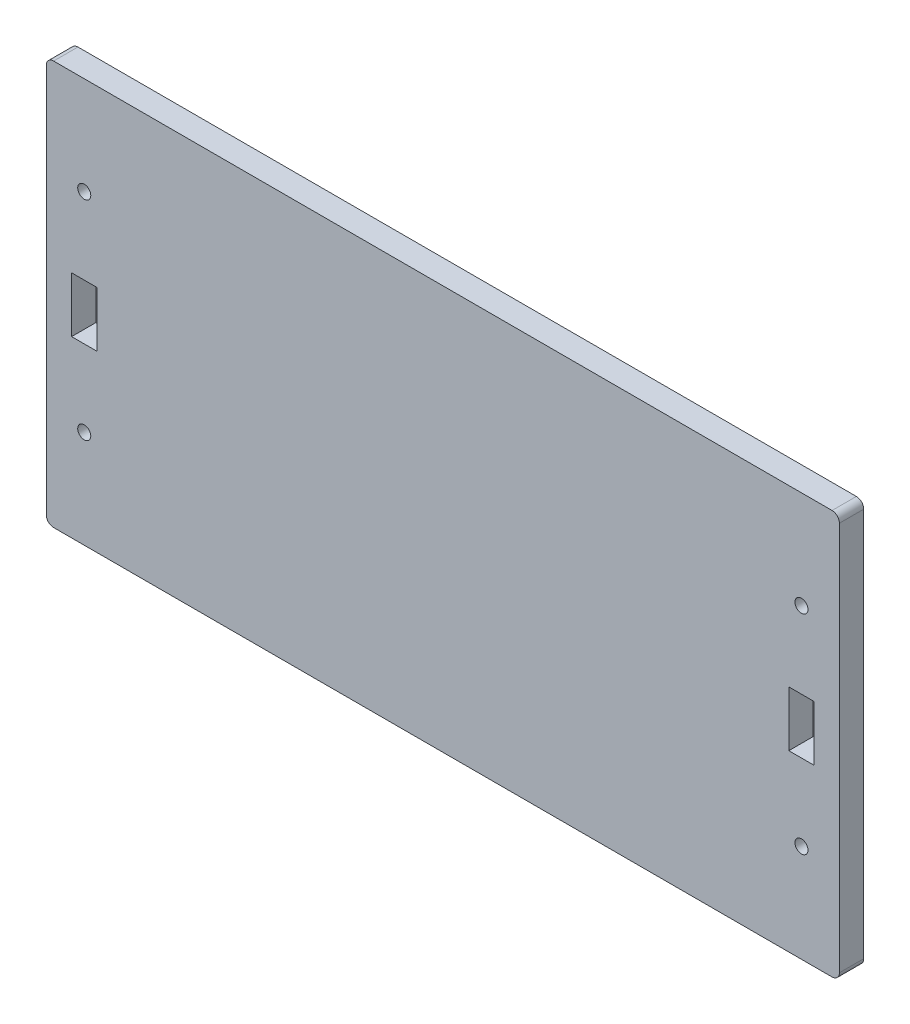
ISO-10303-21;
HEADER;
FILE_DESCRIPTION(('STEP AP214'),'2;1');
FILE_NAME('part.step','',(''),(''),'','','');
FILE_SCHEMA(('AUTOMOTIVE_DESIGN { 1 0 10303 214 1 1 1 1 }'));
ENDSEC;
DATA;
#1=APPLICATION_CONTEXT('core data for automotive mechanical design processes');
#2=APPLICATION_PROTOCOL_DEFINITION('international standard','automotive_design',2000,#1);
#3=PRODUCT_CONTEXT('',#1,'mechanical');
#4=PRODUCT('Part','Part','',(#3));
#5=PRODUCT_RELATED_PRODUCT_CATEGORY('part','',(#4));
#6=PRODUCT_DEFINITION_FORMATION('','',#4);
#7=PRODUCT_DEFINITION_CONTEXT('part definition',#1,'design');
#8=PRODUCT_DEFINITION('design','',#6,#7);
#9=PRODUCT_DEFINITION_SHAPE('','',#8);
#10=(LENGTH_UNIT() NAMED_UNIT(*) SI_UNIT(.MILLI.,.METRE.));
#11=(NAMED_UNIT(*) PLANE_ANGLE_UNIT() SI_UNIT($,.RADIAN.));
#12=(NAMED_UNIT(*) SI_UNIT($,.STERADIAN.) SOLID_ANGLE_UNIT());
#13=UNCERTAINTY_MEASURE_WITH_UNIT(LENGTH_MEASURE(1.E-05),#10,'distance_accuracy_value','');
#14=(GEOMETRIC_REPRESENTATION_CONTEXT(3) GLOBAL_UNCERTAINTY_ASSIGNED_CONTEXT((#13)) GLOBAL_UNIT_ASSIGNED_CONTEXT((#10,
#11,#12)) REPRESENTATION_CONTEXT('',''));
#15=CARTESIAN_POINT('',(0.,0.,0.));
#16=DIRECTION('',(0.,0.,1.));
#17=DIRECTION('',(1.,0.,0.));
#18=AXIS2_PLACEMENT_3D('',#15,#16,#17);
#19=CARTESIAN_POINT('',(213.27999990396,2.00000000000004,6.6));
#20=DIRECTION('',(0.,0.,1.));
#21=DIRECTION('',(1.,0.,0.));
#22=AXIS2_PLACEMENT_3D('',#19,#20,#21);
#23=PLANE('',#22);
#24=DIRECTION('',(1.,0.,0.));
#25=VECTOR('',#24,1.);
#26=CARTESIAN_POINT('',(201.54000000022,47.32615549736,6.6));
#27=LINE('',#26,#25);
#28=CARTESIAN_POINT('',(201.54000000022,47.32615549736,6.6));
#29=VERTEX_POINT('',#28);
#30=CARTESIAN_POINT('',(208.39999999876,47.32615549736,6.6));
#31=VERTEX_POINT('',#30);
#32=EDGE_CURVE('E184',#29,#31,#27,.T.);
#33=ORIENTED_EDGE('',*,*,#32,.F.);
#34=DIRECTION('',(0.,-1.,0.));
#35=VECTOR('',#34,1.);
#36=CARTESIAN_POINT('',(201.54000000022,62.3261554973,6.6));
#37=LINE('',#36,#35);
#38=CARTESIAN_POINT('',(201.54000000022,62.3261554973,6.6));
#39=VERTEX_POINT('',#38);
#40=EDGE_CURVE('E182',#39,#29,#37,.T.);
#41=ORIENTED_EDGE('',*,*,#40,.F.);
#42=DIRECTION('',(-1.,0.,0.));
#43=VECTOR('',#42,1.);
#44=CARTESIAN_POINT('',(208.39999999876,62.3261554973,6.6));
#45=LINE('',#44,#43);
#46=CARTESIAN_POINT('',(208.39999999876,62.3261554973,6.6));
#47=VERTEX_POINT('',#46);
#48=EDGE_CURVE('E190',#47,#39,#45,.T.);
#49=ORIENTED_EDGE('',*,*,#48,.F.);
#50=DIRECTION('',(0.,1.,0.));
#51=VECTOR('',#50,1.);
#52=CARTESIAN_POINT('',(208.39999999876,47.32615549736,6.6));
#53=LINE('',#52,#51);
#54=EDGE_CURVE('E187',#31,#47,#53,.T.);
#55=ORIENTED_EDGE('',*,*,#54,.F.);
#56=EDGE_LOOP('',(#33,#41,#49,#55));
#57=FACE_BOUND('',#56,.T.);
#58=CARTESIAN_POINT('',(204.97000000076,26.55115549804,6.6));
#59=DIRECTION('',(0.,0.,1.));
#60=DIRECTION('',(1.,0.,0.));
#61=AXIS2_PLACEMENT_3D('',#58,#59,#60);
#62=CIRCLE('',#61,1.77500000000005);
#63=CARTESIAN_POINT('',(206.74500000076,26.55115549804,6.6));
#64=VERTEX_POINT('',#63);
#65=EDGE_CURVE('E219',#64,#64,#62,.T.);
#66=ORIENTED_EDGE('',*,*,#65,.F.);
#67=EDGE_LOOP('',(#66));
#68=FACE_BOUND('',#67,.T.);
#69=CARTESIAN_POINT('',(10.30999999972,83.10115549662,6.6));
#70=DIRECTION('',(0.,0.,1.));
#71=DIRECTION('',(1.,0.,0.));
#72=AXIS2_PLACEMENT_3D('',#69,#70,#71);
#73=CIRCLE('',#72,1.77500000000004);
#74=CARTESIAN_POINT('',(12.08499999972,83.10115549662,6.6));
#75=VERTEX_POINT('',#74);
#76=EDGE_CURVE('E231',#75,#75,#73,.T.);
#77=ORIENTED_EDGE('',*,*,#76,.F.);
#78=EDGE_LOOP('',(#77));
#79=FACE_BOUND('',#78,.T.);
#80=CARTESIAN_POINT('',(213.27999990396,2.00000000000004,6.6));
#81=DIRECTION('',(0.,0.,1.));
#82=DIRECTION('',(1.,0.,0.));
#83=AXIS2_PLACEMENT_3D('',#80,#81,#82);
#84=CIRCLE('',#83,2.00000000000005);
#85=CARTESIAN_POINT('',(213.27999990346,0.,6.6));
#86=VERTEX_POINT('',#85);
#87=CARTESIAN_POINT('',(215.27999990396,2.0000000005,6.6));
#88=VERTEX_POINT('',#87);
#89=EDGE_CURVE('E237',#86,#88,#84,.T.);
#90=ORIENTED_EDGE('',*,*,#89,.T.);
#91=DIRECTION('',(0.,1.,0.));
#92=VECTOR('',#91,1.);
#93=CARTESIAN_POINT('',(215.27999990396,2.0000000005,6.6));
#94=LINE('',#93,#92);
#95=CARTESIAN_POINT('',(215.27999990396,107.66000000088,6.6));
#96=VERTEX_POINT('',#95);
#97=EDGE_CURVE('E240',#88,#96,#94,.T.);
#98=ORIENTED_EDGE('',*,*,#97,.T.);
#99=CARTESIAN_POINT('',(213.27999990396,107.65999999884,6.6));
#100=DIRECTION('',(0.,0.,1.));
#101=DIRECTION('',(1.,0.,0.));
#102=AXIS2_PLACEMENT_3D('',#99,#100,#101);
#103=CIRCLE('',#102,1.99999999999997);
#104=CARTESIAN_POINT('',(213.27999990346,109.65999999884,6.6));
#105=VERTEX_POINT('',#104);
#106=EDGE_CURVE('E243',#96,#105,#103,.T.);
#107=ORIENTED_EDGE('',*,*,#106,.T.);
#108=DIRECTION('',(-1.,0.,0.));
#109=VECTOR('',#108,1.);
#110=CARTESIAN_POINT('',(213.27999990346,109.65999999884,6.6));
#111=LINE('',#110,#109);
#112=CARTESIAN_POINT('',(2.0000000005,109.65999999884,6.6));
#113=VERTEX_POINT('',#112);
#114=EDGE_CURVE('E245',#105,#113,#111,.T.);
#115=ORIENTED_EDGE('',*,*,#114,.T.);
#116=CARTESIAN_POINT('',(1.99999999999997,107.65999999884,6.6));
#117=DIRECTION('',(0.,0.,1.));
#118=DIRECTION('',(1.,0.,0.));
#119=AXIS2_PLACEMENT_3D('',#116,#117,#118);
#120=CIRCLE('',#119,1.99999999999997);
#121=CARTESIAN_POINT('',(0.,107.66000000088,6.6));
#122=VERTEX_POINT('',#121);
#123=EDGE_CURVE('E247',#113,#122,#120,.T.);
#124=ORIENTED_EDGE('',*,*,#123,.T.);
#125=DIRECTION('',(0.,-1.,0.));
#126=VECTOR('',#125,1.);
#127=CARTESIAN_POINT('',(0.,107.66000000088,6.6));
#128=LINE('',#127,#126);
#129=CARTESIAN_POINT('',(0.,2.0000000005,6.6));
#130=VERTEX_POINT('',#129);
#131=EDGE_CURVE('E249',#122,#130,#128,.T.);
#132=ORIENTED_EDGE('',*,*,#131,.T.);
#133=CARTESIAN_POINT('',(2.00000000000001,2.00000000000001,6.6));
#134=DIRECTION('',(0.,0.,1.));
#135=DIRECTION('',(1.,0.,0.));
#136=AXIS2_PLACEMENT_3D('',#133,#134,#135);
#137=CIRCLE('',#136,2.00000000000001);
#138=CARTESIAN_POINT('',(2.0000000005,0.,6.6));
#139=VERTEX_POINT('',#138);
#140=EDGE_CURVE('E251',#130,#139,#137,.T.);
#141=ORIENTED_EDGE('',*,*,#140,.T.);
#142=DIRECTION('',(1.,0.,0.));
#143=VECTOR('',#142,1.);
#144=CARTESIAN_POINT('',(2.0000000005,0.,6.6));
#145=LINE('',#144,#143);
#146=EDGE_CURVE('E253',#139,#86,#145,.T.);
#147=ORIENTED_EDGE('',*,*,#146,.T.);
#148=EDGE_LOOP('',(#90,#98,#107,#115,#124,#132,#141,#147));
#149=FACE_BOUND('',#148,.T.);
#150=CARTESIAN_POINT('',(10.30999999972,26.55115549804,6.6));
#151=DIRECTION('',(0.,0.,1.));
#152=DIRECTION('',(1.,0.,0.));
#153=AXIS2_PLACEMENT_3D('',#150,#151,#152);
#154=CIRCLE('',#153,1.77499999999998);
#155=CARTESIAN_POINT('',(12.08499999972,26.55115549804,6.6));
#156=VERTEX_POINT('',#155);
#157=EDGE_CURVE('E225',#156,#156,#154,.T.);
#158=ORIENTED_EDGE('',*,*,#157,.F.);
#159=EDGE_LOOP('',(#158));
#160=FACE_BOUND('',#159,.T.);
#161=CARTESIAN_POINT('',(204.97000000076,83.10115549662,6.6));
#162=DIRECTION('',(0.,0.,1.));
#163=DIRECTION('',(1.,0.,0.));
#164=AXIS2_PLACEMENT_3D('',#161,#162,#163);
#165=CIRCLE('',#164,1.775);
#166=CARTESIAN_POINT('',(206.74500000076,83.10115549662,6.6));
#167=VERTEX_POINT('',#166);
#168=EDGE_CURVE('E213',#167,#167,#165,.T.);
#169=ORIENTED_EDGE('',*,*,#168,.F.);
#170=EDGE_LOOP('',(#169));
#171=FACE_BOUND('',#170,.T.);
#172=DIRECTION('',(0.,1.,0.));
#173=VECTOR('',#172,1.);
#174=CARTESIAN_POINT('',(13.74000000026,47.32615549736,6.6));
#175=LINE('',#174,#173);
#176=CARTESIAN_POINT('',(13.74000000026,47.32615549736,6.6));
#177=VERTEX_POINT('',#176);
#178=CARTESIAN_POINT('',(13.74000000026,62.3261554973,6.6));
#179=VERTEX_POINT('',#178);
#180=EDGE_CURVE('E154',#177,#179,#175,.T.);
#181=ORIENTED_EDGE('',*,*,#180,.F.);
#182=DIRECTION('',(1.,0.,0.));
#183=VECTOR('',#182,1.);
#184=CARTESIAN_POINT('',(6.87999999918,47.32615549736,6.6));
#185=LINE('',#184,#183);
#186=CARTESIAN_POINT('',(6.87999999918,47.32615549736,6.6));
#187=VERTEX_POINT('',#186);
#188=EDGE_CURVE('E146',#187,#177,#185,.T.);
#189=ORIENTED_EDGE('',*,*,#188,.F.);
#190=DIRECTION('',(0.,-1.,0.));
#191=VECTOR('',#190,1.);
#192=CARTESIAN_POINT('',(6.87999999918,62.3261554973,6.6));
#193=LINE('',#192,#191);
#194=CARTESIAN_POINT('',(6.87999999917999,62.3261554973,6.6));
#195=VERTEX_POINT('',#194);
#196=EDGE_CURVE('E168',#195,#187,#193,.T.);
#197=ORIENTED_EDGE('',*,*,#196,.F.);
#198=DIRECTION('',(-1.,0.,0.));
#199=VECTOR('',#198,1.);
#200=CARTESIAN_POINT('',(13.74000000026,62.3261554973,6.6));
#201=LINE('',#200,#199);
#202=EDGE_CURVE('E166',#179,#195,#201,.T.);
#203=ORIENTED_EDGE('',*,*,#202,.F.);
#204=EDGE_LOOP('',(#181,#189,#197,#203));
#205=FACE_BOUND('',#204,.T.);
#206=ADVANCED_FACE('F33',(#57,#68,#79,#149,#160,#171,#205),#23,.T.);
#207=CARTESIAN_POINT('',(213.27999990396,2.00000000000004,0.));
#208=DIRECTION('',(0.,0.,1.));
#209=DIRECTION('',(1.,0.,0.));
#210=AXIS2_PLACEMENT_3D('',#207,#208,#209);
#211=PLANE('',#210);
#212=DIRECTION('',(0.,-1.,0.));
#213=VECTOR('',#212,1.);
#214=CARTESIAN_POINT('',(201.54000000022,62.3261554973,0.));
#215=LINE('',#214,#213);
#216=CARTESIAN_POINT('',(201.54000000022,62.3261554973,0.));
#217=VERTEX_POINT('',#216);
#218=CARTESIAN_POINT('',(201.54000000022,47.32615549736,0.));
#219=VERTEX_POINT('',#218);
#220=EDGE_CURVE('E162',#217,#219,#215,.T.);
#221=ORIENTED_EDGE('',*,*,#220,.T.);
#222=DIRECTION('',(1.,0.,0.));
#223=VECTOR('',#222,1.);
#224=CARTESIAN_POINT('',(201.54000000022,47.32615549736,0.));
#225=LINE('',#224,#223);
#226=CARTESIAN_POINT('',(208.39999999876,47.32615549736,0.));
#227=VERTEX_POINT('',#226);
#228=EDGE_CURVE('E195',#219,#227,#225,.T.);
#229=ORIENTED_EDGE('',*,*,#228,.T.);
#230=DIRECTION('',(0.,1.,0.));
#231=VECTOR('',#230,1.);
#232=CARTESIAN_POINT('',(208.39999999876,47.32615549736,0.));
#233=LINE('',#232,#231);
#234=CARTESIAN_POINT('',(208.39999999876,62.3261554973,0.));
#235=VERTEX_POINT('',#234);
#236=EDGE_CURVE('E198',#227,#235,#233,.T.);
#237=ORIENTED_EDGE('',*,*,#236,.T.);
#238=DIRECTION('',(-1.,0.,0.));
#239=VECTOR('',#238,1.);
#240=CARTESIAN_POINT('',(208.39999999876,62.3261554973,0.));
#241=LINE('',#240,#239);
#242=EDGE_CURVE('E185',#235,#217,#241,.T.);
#243=ORIENTED_EDGE('',*,*,#242,.T.);
#244=EDGE_LOOP('',(#221,#229,#237,#243));
#245=FACE_BOUND('',#244,.T.);
#246=CARTESIAN_POINT('',(204.97000000076,26.55115549804,0.));
#247=DIRECTION('',(0.,0.,1.));
#248=DIRECTION('',(1.,0.,0.));
#249=AXIS2_PLACEMENT_3D('',#246,#247,#248);
#250=CIRCLE('',#249,1.77500000000005);
#251=CARTESIAN_POINT('',(206.74500000076,26.55115549804,0.));
#252=VERTEX_POINT('',#251);
#253=EDGE_CURVE('E216',#252,#252,#250,.T.);
#254=ORIENTED_EDGE('',*,*,#253,.T.);
#255=EDGE_LOOP('',(#254));
#256=FACE_BOUND('',#255,.T.);
#257=CARTESIAN_POINT('',(10.30999999972,83.10115549662,0.));
#258=DIRECTION('',(0.,0.,1.));
#259=DIRECTION('',(1.,0.,0.));
#260=AXIS2_PLACEMENT_3D('',#257,#258,#259);
#261=CIRCLE('',#260,1.77500000000004);
#262=CARTESIAN_POINT('',(12.08499999972,83.10115549662,0.));
#263=VERTEX_POINT('',#262);
#264=EDGE_CURVE('E228',#263,#263,#261,.T.);
#265=ORIENTED_EDGE('',*,*,#264,.T.);
#266=EDGE_LOOP('',(#265));
#267=FACE_BOUND('',#266,.T.);
#268=CARTESIAN_POINT('',(213.27999990396,2.00000000000004,0.));
#269=DIRECTION('',(0.,0.,1.));
#270=DIRECTION('',(1.,0.,0.));
#271=AXIS2_PLACEMENT_3D('',#268,#269,#270);
#272=CIRCLE('',#271,2.00000000000005);
#273=CARTESIAN_POINT('',(213.27999990346,0.,0.));
#274=VERTEX_POINT('',#273);
#275=CARTESIAN_POINT('',(215.27999990396,2.0000000005,0.));
#276=VERTEX_POINT('',#275);
#277=EDGE_CURVE('E234',#274,#276,#272,.T.);
#278=ORIENTED_EDGE('',*,*,#277,.F.);
#279=DIRECTION('',(1.,0.,0.));
#280=VECTOR('',#279,1.);
#281=CARTESIAN_POINT('',(2.0000000005,0.,0.));
#282=LINE('',#281,#280);
#283=CARTESIAN_POINT('',(2.0000000005,0.,0.));
#284=VERTEX_POINT('',#283);
#285=EDGE_CURVE('E241',#284,#274,#282,.T.);
#286=ORIENTED_EDGE('',*,*,#285,.F.);
#287=CARTESIAN_POINT('',(2.00000000000001,2.00000000000001,0.));
#288=DIRECTION('',(0.,0.,1.));
#289=DIRECTION('',(1.,0.,0.));
#290=AXIS2_PLACEMENT_3D('',#287,#288,#289);
#291=CIRCLE('',#290,2.00000000000001);
#292=CARTESIAN_POINT('',(0.,2.0000000005,0.));
#293=VERTEX_POINT('',#292);
#294=EDGE_CURVE('E268',#293,#284,#291,.T.);
#295=ORIENTED_EDGE('',*,*,#294,.F.);
#296=DIRECTION('',(0.,-1.,0.));
#297=VECTOR('',#296,1.);
#298=CARTESIAN_POINT('',(0.,107.66000000088,0.));
#299=LINE('',#298,#297);
#300=CARTESIAN_POINT('',(0.,107.66000000088,0.));
#301=VERTEX_POINT('',#300);
#302=EDGE_CURVE('E266',#301,#293,#299,.T.);
#303=ORIENTED_EDGE('',*,*,#302,.F.);
#304=CARTESIAN_POINT('',(1.99999999999997,107.65999999884,0.));
#305=DIRECTION('',(0.,0.,1.));
#306=DIRECTION('',(1.,0.,0.));
#307=AXIS2_PLACEMENT_3D('',#304,#305,#306);
#308=CIRCLE('',#307,1.99999999999997);
#309=CARTESIAN_POINT('',(2.0000000005,109.65999999884,0.));
#310=VERTEX_POINT('',#309);
#311=EDGE_CURVE('E264',#310,#301,#308,.T.);
#312=ORIENTED_EDGE('',*,*,#311,.F.);
#313=DIRECTION('',(-1.,0.,0.));
#314=VECTOR('',#313,1.);
#315=CARTESIAN_POINT('',(213.27999990346,109.65999999884,0.));
#316=LINE('',#315,#314);
#317=CARTESIAN_POINT('',(213.27999990346,109.65999999884,0.));
#318=VERTEX_POINT('',#317);
#319=EDGE_CURVE('E262',#318,#310,#316,.T.);
#320=ORIENTED_EDGE('',*,*,#319,.F.);
#321=CARTESIAN_POINT('',(213.27999990396,107.65999999884,0.));
#322=DIRECTION('',(0.,0.,1.));
#323=DIRECTION('',(1.,0.,0.));
#324=AXIS2_PLACEMENT_3D('',#321,#322,#323);
#325=CIRCLE('',#324,1.99999999999997);
#326=CARTESIAN_POINT('',(215.27999990396,107.66000000088,0.));
#327=VERTEX_POINT('',#326);
#328=EDGE_CURVE('E260',#327,#318,#325,.T.);
#329=ORIENTED_EDGE('',*,*,#328,.F.);
#330=DIRECTION('',(0.,1.,0.));
#331=VECTOR('',#330,1.);
#332=CARTESIAN_POINT('',(215.27999990396,2.0000000005,0.));
#333=LINE('',#332,#331);
#334=EDGE_CURVE('E258',#276,#327,#333,.T.);
#335=ORIENTED_EDGE('',*,*,#334,.F.);
#336=EDGE_LOOP('',(#278,#286,#295,#303,#312,#320,#329,#335));
#337=FACE_BOUND('',#336,.T.);
#338=CARTESIAN_POINT('',(10.30999999972,26.55115549804,0.));
#339=DIRECTION('',(0.,0.,1.));
#340=DIRECTION('',(1.,0.,0.));
#341=AXIS2_PLACEMENT_3D('',#338,#339,#340);
#342=CIRCLE('',#341,1.77499999999998);
#343=CARTESIAN_POINT('',(12.08499999972,26.55115549804,0.));
#344=VERTEX_POINT('',#343);
#345=EDGE_CURVE('E222',#344,#344,#342,.T.);
#346=ORIENTED_EDGE('',*,*,#345,.T.);
#347=EDGE_LOOP('',(#346));
#348=FACE_BOUND('',#347,.T.);
#349=CARTESIAN_POINT('',(204.97000000076,83.10115549662,0.));
#350=DIRECTION('',(0.,0.,1.));
#351=DIRECTION('',(1.,0.,0.));
#352=AXIS2_PLACEMENT_3D('',#349,#350,#351);
#353=CIRCLE('',#352,1.775);
#354=CARTESIAN_POINT('',(206.74500000076,83.10115549662,0.));
#355=VERTEX_POINT('',#354);
#356=EDGE_CURVE('E212',#355,#355,#353,.T.);
#357=ORIENTED_EDGE('',*,*,#356,.T.);
#358=EDGE_LOOP('',(#357));
#359=FACE_BOUND('',#358,.T.);
#360=DIRECTION('',(1.,0.,0.));
#361=VECTOR('',#360,1.);
#362=CARTESIAN_POINT('',(6.87999999918,47.32615549736,0.));
#363=LINE('',#362,#361);
#364=CARTESIAN_POINT('',(6.87999999917999,47.32615549736,0.));
#365=VERTEX_POINT('',#364);
#366=CARTESIAN_POINT('',(13.74000000026,47.32615549736,0.));
#367=VERTEX_POINT('',#366);
#368=EDGE_CURVE('E56',#365,#367,#363,.T.);
#369=ORIENTED_EDGE('',*,*,#368,.T.);
#370=DIRECTION('',(0.,1.,0.));
#371=VECTOR('',#370,1.);
#372=CARTESIAN_POINT('',(13.74000000026,47.32615549736,0.));
#373=LINE('',#372,#371);
#374=CARTESIAN_POINT('',(13.74000000026,62.3261554973,0.));
#375=VERTEX_POINT('',#374);
#376=EDGE_CURVE('E161',#367,#375,#373,.T.);
#377=ORIENTED_EDGE('',*,*,#376,.T.);
#378=DIRECTION('',(-1.,0.,0.));
#379=VECTOR('',#378,1.);
#380=CARTESIAN_POINT('',(13.74000000026,62.3261554973,0.));
#381=LINE('',#380,#379);
#382=CARTESIAN_POINT('',(6.87999999918,62.3261554973,0.));
#383=VERTEX_POINT('',#382);
#384=EDGE_CURVE('E174',#375,#383,#381,.T.);
#385=ORIENTED_EDGE('',*,*,#384,.T.);
#386=DIRECTION('',(0.,-1.,0.));
#387=VECTOR('',#386,1.);
#388=CARTESIAN_POINT('',(6.87999999918,62.3261554973,0.));
#389=LINE('',#388,#387);
#390=EDGE_CURVE('E155',#383,#365,#389,.T.);
#391=ORIENTED_EDGE('',*,*,#390,.T.);
#392=EDGE_LOOP('',(#369,#377,#385,#391));
#393=FACE_BOUND('',#392,.T.);
#394=ADVANCED_FACE('F298',(#245,#256,#267,#337,#348,#359,#393),#211,.F.);
#395=CARTESIAN_POINT('',(213.27999990396,2.00000000000004,6.6));
#396=DIRECTION('',(0.,0.,-1.));
#397=DIRECTION('',(-1.,0.,0.));
#398=AXIS2_PLACEMENT_3D('',#395,#396,#397);
#399=CYLINDRICAL_SURFACE('',#398,2.00000000000005);
#400=ORIENTED_EDGE('',*,*,#277,.T.);
#401=DIRECTION('',(0.,0.,-1.));
#402=VECTOR('',#401,1.);
#403=CARTESIAN_POINT('',(215.27999990396,2.0000000005,6.6));
#404=LINE('',#403,#402);
#405=EDGE_CURVE('E11',#88,#276,#404,.T.);
#406=ORIENTED_EDGE('',*,*,#405,.F.);
#407=ORIENTED_EDGE('',*,*,#89,.F.);
#408=DIRECTION('',(0.,0.,-1.));
#409=VECTOR('',#408,1.);
#410=CARTESIAN_POINT('',(213.27999990346,0.,6.6));
#411=LINE('',#410,#409);
#412=EDGE_CURVE('E255',#86,#274,#411,.T.);
#413=ORIENTED_EDGE('',*,*,#412,.T.);
#414=EDGE_LOOP('',(#400,#406,#407,#413));
#415=FACE_BOUND('',#414,.T.);
#416=ADVANCED_FACE('F35',(#415),#399,.T.);
#417=CARTESIAN_POINT('',(215.27999990396,2.0000000005,6.6));
#418=DIRECTION('',(-1.,0.,0.));
#419=DIRECTION('',(0.,0.,1.));
#420=AXIS2_PLACEMENT_3D('',#417,#418,#419);
#421=PLANE('',#420);
#422=ORIENTED_EDGE('',*,*,#334,.T.);
#423=DIRECTION('',(0.,0.,-1.));
#424=VECTOR('',#423,1.);
#425=CARTESIAN_POINT('',(215.27999990396,107.66000000088,6.6));
#426=LINE('',#425,#424);
#427=EDGE_CURVE('E41',#96,#327,#426,.T.);
#428=ORIENTED_EDGE('',*,*,#427,.F.);
#429=ORIENTED_EDGE('',*,*,#97,.F.);
#430=ORIENTED_EDGE('',*,*,#405,.T.);
#431=EDGE_LOOP('',(#422,#428,#429,#430));
#432=FACE_BOUND('',#431,.T.);
#433=ADVANCED_FACE('F316',(#432),#421,.F.);
#434=CARTESIAN_POINT('',(213.27999990396,107.65999999884,6.6));
#435=DIRECTION('',(0.,0.,-1.));
#436=DIRECTION('',(-1.,0.,0.));
#437=AXIS2_PLACEMENT_3D('',#434,#435,#436);
#438=CYLINDRICAL_SURFACE('',#437,1.99999999999997);
#439=ORIENTED_EDGE('',*,*,#328,.T.);
#440=DIRECTION('',(0.,0.,-1.));
#441=VECTOR('',#440,1.);
#442=CARTESIAN_POINT('',(213.27999990346,109.65999999884,6.6));
#443=LINE('',#442,#441);
#444=EDGE_CURVE('E285',#105,#318,#443,.T.);
#445=ORIENTED_EDGE('',*,*,#444,.F.);
#446=ORIENTED_EDGE('',*,*,#106,.F.);
#447=ORIENTED_EDGE('',*,*,#427,.T.);
#448=EDGE_LOOP('',(#439,#445,#446,#447));
#449=FACE_BOUND('',#448,.T.);
#450=ADVANCED_FACE('F292',(#449),#438,.T.);
#451=CARTESIAN_POINT('',(213.27999990346,109.65999999884,6.6));
#452=DIRECTION('',(0.,-1.,0.));
#453=DIRECTION('',(0.,0.,-1.));
#454=AXIS2_PLACEMENT_3D('',#451,#452,#453);
#455=PLANE('',#454);
#456=ORIENTED_EDGE('',*,*,#319,.T.);
#457=DIRECTION('',(0.,0.,-1.));
#458=VECTOR('',#457,1.);
#459=CARTESIAN_POINT('',(2.0000000005,109.65999999884,6.6));
#460=LINE('',#459,#458);
#461=EDGE_CURVE('E282',#113,#310,#460,.T.);
#462=ORIENTED_EDGE('',*,*,#461,.F.);
#463=ORIENTED_EDGE('',*,*,#114,.F.);
#464=ORIENTED_EDGE('',*,*,#444,.T.);
#465=EDGE_LOOP('',(#456,#462,#463,#464));
#466=FACE_BOUND('',#465,.T.);
#467=ADVANCED_FACE('F304',(#466),#455,.F.);
#468=CARTESIAN_POINT('',(1.99999999999997,107.65999999884,6.6));
#469=DIRECTION('',(0.,0.,-1.));
#470=DIRECTION('',(-1.,0.,0.));
#471=AXIS2_PLACEMENT_3D('',#468,#469,#470);
#472=CYLINDRICAL_SURFACE('',#471,1.99999999999997);
#473=ORIENTED_EDGE('',*,*,#311,.T.);
#474=DIRECTION('',(0.,0.,-1.));
#475=VECTOR('',#474,1.);
#476=CARTESIAN_POINT('',(0.,107.66000000088,6.6));
#477=LINE('',#476,#475);
#478=EDGE_CURVE('E279',#122,#301,#477,.T.);
#479=ORIENTED_EDGE('',*,*,#478,.F.);
#480=ORIENTED_EDGE('',*,*,#123,.F.);
#481=ORIENTED_EDGE('',*,*,#461,.T.);
#482=EDGE_LOOP('',(#473,#479,#480,#481));
#483=FACE_BOUND('',#482,.T.);
#484=ADVANCED_FACE('F308',(#483),#472,.T.);
#485=CARTESIAN_POINT('',(0.,107.66000000088,6.6));
#486=DIRECTION('',(1.,0.,0.));
#487=DIRECTION('',(0.,0.,-1.));
#488=AXIS2_PLACEMENT_3D('',#485,#486,#487);
#489=PLANE('',#488);
#490=ORIENTED_EDGE('',*,*,#302,.T.);
#491=DIRECTION('',(0.,0.,-1.));
#492=VECTOR('',#491,1.);
#493=CARTESIAN_POINT('',(0.,2.0000000005,6.6));
#494=LINE('',#493,#492);
#495=EDGE_CURVE('E276',#130,#293,#494,.T.);
#496=ORIENTED_EDGE('',*,*,#495,.F.);
#497=ORIENTED_EDGE('',*,*,#131,.F.);
#498=ORIENTED_EDGE('',*,*,#478,.T.);
#499=EDGE_LOOP('',(#490,#496,#497,#498));
#500=FACE_BOUND('',#499,.T.);
#501=ADVANCED_FACE('F329',(#500),#489,.F.);
#502=CARTESIAN_POINT('',(2.00000000000001,2.00000000000001,6.6));
#503=DIRECTION('',(0.,0.,-1.));
#504=DIRECTION('',(-1.,0.,0.));
#505=AXIS2_PLACEMENT_3D('',#502,#503,#504);
#506=CYLINDRICAL_SURFACE('',#505,2.00000000000001);
#507=ORIENTED_EDGE('',*,*,#294,.T.);
#508=DIRECTION('',(0.,0.,-1.));
#509=VECTOR('',#508,1.);
#510=CARTESIAN_POINT('',(2.0000000005,0.,6.6));
#511=LINE('',#510,#509);
#512=EDGE_CURVE('E273',#139,#284,#511,.T.);
#513=ORIENTED_EDGE('',*,*,#512,.F.);
#514=ORIENTED_EDGE('',*,*,#140,.F.);
#515=ORIENTED_EDGE('',*,*,#495,.T.);
#516=EDGE_LOOP('',(#507,#513,#514,#515));
#517=FACE_BOUND('',#516,.T.);
#518=ADVANCED_FACE('F327',(#517),#506,.T.);
#519=CARTESIAN_POINT('',(2.0000000005,0.,6.6));
#520=DIRECTION('',(0.,1.,0.));
#521=DIRECTION('',(0.,0.,1.));
#522=AXIS2_PLACEMENT_3D('',#519,#520,#521);
#523=PLANE('',#522);
#524=ORIENTED_EDGE('',*,*,#285,.T.);
#525=ORIENTED_EDGE('',*,*,#412,.F.);
#526=ORIENTED_EDGE('',*,*,#146,.F.);
#527=ORIENTED_EDGE('',*,*,#512,.T.);
#528=EDGE_LOOP('',(#524,#525,#526,#527));
#529=FACE_BOUND('',#528,.T.);
#530=ADVANCED_FACE('F322',(#529),#523,.F.);
#531=CARTESIAN_POINT('',(10.30999999972,83.10115549662,6.6));
#532=DIRECTION('',(0.,0.,-1.));
#533=DIRECTION('',(-1.,0.,0.));
#534=AXIS2_PLACEMENT_3D('',#531,#532,#533);
#535=CYLINDRICAL_SURFACE('',#534,1.77500000000004);
#536=ORIENTED_EDGE('',*,*,#76,.T.);
#537=EDGE_LOOP('',(#536));
#538=FACE_BOUND('',#537,.T.);
#539=ORIENTED_EDGE('',*,*,#264,.F.);
#540=EDGE_LOOP('',(#539));
#541=FACE_BOUND('',#540,.T.);
#542=ADVANCED_FACE('F349',(#538,#541),#535,.F.);
#543=CARTESIAN_POINT('',(10.30999999972,26.55115549804,6.6));
#544=DIRECTION('',(0.,0.,-1.));
#545=DIRECTION('',(-1.,0.,0.));
#546=AXIS2_PLACEMENT_3D('',#543,#544,#545);
#547=CYLINDRICAL_SURFACE('',#546,1.77499999999998);
#548=ORIENTED_EDGE('',*,*,#157,.T.);
#549=EDGE_LOOP('',(#548));
#550=FACE_BOUND('',#549,.T.);
#551=ORIENTED_EDGE('',*,*,#345,.F.);
#552=EDGE_LOOP('',(#551));
#553=FACE_BOUND('',#552,.T.);
#554=ADVANCED_FACE('F356',(#550,#553),#547,.F.);
#555=CARTESIAN_POINT('',(204.97000000076,26.55115549804,6.6));
#556=DIRECTION('',(0.,0.,-1.));
#557=DIRECTION('',(-1.,0.,0.));
#558=AXIS2_PLACEMENT_3D('',#555,#556,#557);
#559=CYLINDRICAL_SURFACE('',#558,1.77500000000005);
#560=ORIENTED_EDGE('',*,*,#65,.T.);
#561=EDGE_LOOP('',(#560));
#562=FACE_BOUND('',#561,.T.);
#563=ORIENTED_EDGE('',*,*,#253,.F.);
#564=EDGE_LOOP('',(#563));
#565=FACE_BOUND('',#564,.T.);
#566=ADVANCED_FACE('F361',(#562,#565),#559,.F.);
#567=CARTESIAN_POINT('',(204.97000000076,83.10115549662,6.6));
#568=DIRECTION('',(0.,0.,-1.));
#569=DIRECTION('',(-1.,0.,0.));
#570=AXIS2_PLACEMENT_3D('',#567,#568,#569);
#571=CYLINDRICAL_SURFACE('',#570,1.775);
#572=ORIENTED_EDGE('',*,*,#168,.T.);
#573=EDGE_LOOP('',(#572));
#574=FACE_BOUND('',#573,.T.);
#575=ORIENTED_EDGE('',*,*,#356,.F.);
#576=EDGE_LOOP('',(#575));
#577=FACE_BOUND('',#576,.T.);
#578=ADVANCED_FACE('F371',(#574,#577),#571,.F.);
#579=CARTESIAN_POINT('',(201.54000000022,62.3261554973,6.6));
#580=DIRECTION('',(1.,0.,0.));
#581=DIRECTION('',(0.,0.,-1.));
#582=AXIS2_PLACEMENT_3D('',#579,#580,#581);
#583=PLANE('',#582);
#584=ORIENTED_EDGE('',*,*,#220,.F.);
#585=DIRECTION('',(0.,0.,-1.));
#586=VECTOR('',#585,1.);
#587=CARTESIAN_POINT('',(201.54000000022,62.3261554973,6.6));
#588=LINE('',#587,#586);
#589=EDGE_CURVE('E192',#39,#217,#588,.T.);
#590=ORIENTED_EDGE('',*,*,#589,.F.);
#591=ORIENTED_EDGE('',*,*,#40,.T.);
#592=DIRECTION('',(0.,0.,-1.));
#593=VECTOR('',#592,1.);
#594=CARTESIAN_POINT('',(201.54000000022,47.32615549736,6.6));
#595=LINE('',#594,#593);
#596=EDGE_CURVE('E209',#29,#219,#595,.T.);
#597=ORIENTED_EDGE('',*,*,#596,.T.);
#598=EDGE_LOOP('',(#584,#590,#591,#597));
#599=FACE_BOUND('',#598,.T.);
#600=ADVANCED_FACE('F378',(#599),#583,.T.);
#601=CARTESIAN_POINT('',(201.54000000022,47.32615549736,6.6));
#602=DIRECTION('',(0.,1.,0.));
#603=DIRECTION('',(0.,0.,1.));
#604=AXIS2_PLACEMENT_3D('',#601,#602,#603);
#605=PLANE('',#604);
#606=ORIENTED_EDGE('',*,*,#228,.F.);
#607=ORIENTED_EDGE('',*,*,#596,.F.);
#608=ORIENTED_EDGE('',*,*,#32,.T.);
#609=DIRECTION('',(0.,0.,-1.));
#610=VECTOR('',#609,1.);
#611=CARTESIAN_POINT('',(208.39999999876,47.32615549736,6.6));
#612=LINE('',#611,#610);
#613=EDGE_CURVE('E207',#31,#227,#612,.T.);
#614=ORIENTED_EDGE('',*,*,#613,.T.);
#615=EDGE_LOOP('',(#606,#607,#608,#614));
#616=FACE_BOUND('',#615,.T.);
#617=ADVANCED_FACE('F382',(#616),#605,.T.);
#618=CARTESIAN_POINT('',(208.39999999876,47.32615549736,6.6));
#619=DIRECTION('',(-1.,0.,0.));
#620=DIRECTION('',(0.,0.,1.));
#621=AXIS2_PLACEMENT_3D('',#618,#619,#620);
#622=PLANE('',#621);
#623=ORIENTED_EDGE('',*,*,#236,.F.);
#624=ORIENTED_EDGE('',*,*,#613,.F.);
#625=ORIENTED_EDGE('',*,*,#54,.T.);
#626=DIRECTION('',(0.,0.,-1.));
#627=VECTOR('',#626,1.);
#628=CARTESIAN_POINT('',(208.39999999876,62.3261554973,6.6));
#629=LINE('',#628,#627);
#630=EDGE_CURVE('E205',#47,#235,#629,.T.);
#631=ORIENTED_EDGE('',*,*,#630,.T.);
#632=EDGE_LOOP('',(#623,#624,#625,#631));
#633=FACE_BOUND('',#632,.T.);
#634=ADVANCED_FACE('F386',(#633),#622,.T.);
#635=CARTESIAN_POINT('',(208.39999999876,62.3261554973,6.6));
#636=DIRECTION('',(0.,-1.,0.));
#637=DIRECTION('',(0.,0.,-1.));
#638=AXIS2_PLACEMENT_3D('',#635,#636,#637);
#639=PLANE('',#638);
#640=ORIENTED_EDGE('',*,*,#242,.F.);
#641=ORIENTED_EDGE('',*,*,#630,.F.);
#642=ORIENTED_EDGE('',*,*,#48,.T.);
#643=ORIENTED_EDGE('',*,*,#589,.T.);
#644=EDGE_LOOP('',(#640,#641,#642,#643));
#645=FACE_BOUND('',#644,.T.);
#646=ADVANCED_FACE('F390',(#645),#639,.T.);
#647=CARTESIAN_POINT('',(6.87999999918,47.32615549736,6.6));
#648=DIRECTION('',(0.,1.,0.));
#649=DIRECTION('',(0.,0.,1.));
#650=AXIS2_PLACEMENT_3D('',#647,#648,#649);
#651=PLANE('',#650);
#652=ORIENTED_EDGE('',*,*,#368,.F.);
#653=DIRECTION('',(0.,0.,-1.));
#654=VECTOR('',#653,1.);
#655=CARTESIAN_POINT('',(6.87999999918,47.32615549736,6.6));
#656=LINE('',#655,#654);
#657=EDGE_CURVE('E150',#187,#365,#656,.T.);
#658=ORIENTED_EDGE('',*,*,#657,.F.);
#659=ORIENTED_EDGE('',*,*,#188,.T.);
#660=DIRECTION('',(0.,0.,-1.));
#661=VECTOR('',#660,1.);
#662=CARTESIAN_POINT('',(13.74000000026,47.32615549736,6.6));
#663=LINE('',#662,#661);
#664=EDGE_CURVE('E149',#177,#367,#663,.T.);
#665=ORIENTED_EDGE('',*,*,#664,.T.);
#666=EDGE_LOOP('',(#652,#658,#659,#665));
#667=FACE_BOUND('',#666,.T.);
#668=ADVANCED_FACE('F148',(#667),#651,.T.);
#669=CARTESIAN_POINT('',(13.74000000026,47.32615549736,6.6));
#670=DIRECTION('',(-1.,0.,0.));
#671=DIRECTION('',(0.,0.,1.));
#672=AXIS2_PLACEMENT_3D('',#669,#670,#671);
#673=PLANE('',#672);
#674=ORIENTED_EDGE('',*,*,#376,.F.);
#675=ORIENTED_EDGE('',*,*,#664,.F.);
#676=ORIENTED_EDGE('',*,*,#180,.T.);
#677=DIRECTION('',(0.,0.,-1.));
#678=VECTOR('',#677,1.);
#679=CARTESIAN_POINT('',(13.74000000026,62.3261554973,6.6));
#680=LINE('',#679,#678);
#681=EDGE_CURVE('E163',#179,#375,#680,.T.);
#682=ORIENTED_EDGE('',*,*,#681,.T.);
#683=EDGE_LOOP('',(#674,#675,#676,#682));
#684=FACE_BOUND('',#683,.T.);
#685=ADVANCED_FACE('F158',(#684),#673,.T.);
#686=CARTESIAN_POINT('',(13.74000000026,62.3261554973,6.6));
#687=DIRECTION('',(0.,-1.,0.));
#688=DIRECTION('',(0.,0.,-1.));
#689=AXIS2_PLACEMENT_3D('',#686,#687,#688);
#690=PLANE('',#689);
#691=ORIENTED_EDGE('',*,*,#384,.F.);
#692=ORIENTED_EDGE('',*,*,#681,.F.);
#693=ORIENTED_EDGE('',*,*,#202,.T.);
#694=DIRECTION('',(0.,0.,-1.));
#695=VECTOR('',#694,1.);
#696=CARTESIAN_POINT('',(6.87999999918,62.3261554973,6.6));
#697=LINE('',#696,#695);
#698=EDGE_CURVE('E48',#195,#383,#697,.T.);
#699=ORIENTED_EDGE('',*,*,#698,.T.);
#700=EDGE_LOOP('',(#691,#692,#693,#699));
#701=FACE_BOUND('',#700,.T.);
#702=ADVANCED_FACE('F399',(#701),#690,.T.);
#703=CARTESIAN_POINT('',(6.87999999918,62.3261554973,6.6));
#704=DIRECTION('',(1.,0.,0.));
#705=DIRECTION('',(0.,0.,-1.));
#706=AXIS2_PLACEMENT_3D('',#703,#704,#705);
#707=PLANE('',#706);
#708=ORIENTED_EDGE('',*,*,#390,.F.);
#709=ORIENTED_EDGE('',*,*,#698,.F.);
#710=ORIENTED_EDGE('',*,*,#196,.T.);
#711=ORIENTED_EDGE('',*,*,#657,.T.);
#712=EDGE_LOOP('',(#708,#709,#710,#711));
#713=FACE_BOUND('',#712,.T.);
#714=ADVANCED_FACE('F402',(#713),#707,.T.);
#715=CLOSED_SHELL('',(#206,#394,#416,#433,#450,#467,#484,#501,#518,#530,#542,#554,#566,#578,
#600,#617,#634,#646,#668,#685,#702,#714));
#716=MANIFOLD_SOLID_BREP('B2',#715);
#717=ADVANCED_BREP_SHAPE_REPRESENTATION('',(#18,#716),#14);
#718=SHAPE_DEFINITION_REPRESENTATION(#9,#717);
ENDSEC;
END-ISO-10303-21;
